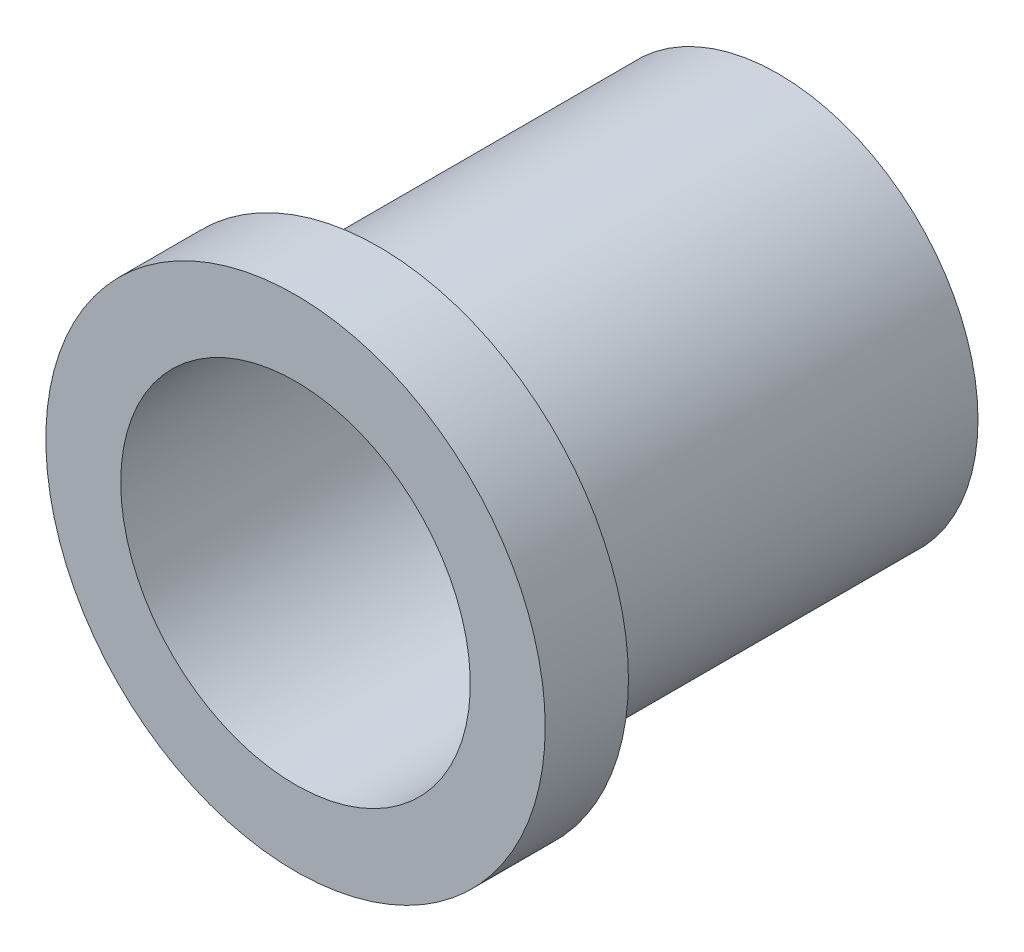
ISO-10303-21;
HEADER;
FILE_DESCRIPTION(('STEP AP214'),'2;1');
FILE_NAME('part.step','',(''),(''),'','','');
FILE_SCHEMA(('AUTOMOTIVE_DESIGN { 1 0 10303 214 1 1 1 1 }'));
ENDSEC;
DATA;
#1=APPLICATION_CONTEXT('core data for automotive mechanical design processes');
#2=APPLICATION_PROTOCOL_DEFINITION('international standard','automotive_design',2000,#1);
#3=PRODUCT_CONTEXT('',#1,'mechanical');
#4=PRODUCT('Part','Part','',(#3));
#5=PRODUCT_RELATED_PRODUCT_CATEGORY('part','',(#4));
#6=PRODUCT_DEFINITION_FORMATION('','',#4);
#7=PRODUCT_DEFINITION_CONTEXT('part definition',#1,'design');
#8=PRODUCT_DEFINITION('design','',#6,#7);
#9=PRODUCT_DEFINITION_SHAPE('','',#8);
#10=(LENGTH_UNIT() NAMED_UNIT(*) SI_UNIT(.MILLI.,.METRE.));
#11=(NAMED_UNIT(*) PLANE_ANGLE_UNIT() SI_UNIT($,.RADIAN.));
#12=(NAMED_UNIT(*) SI_UNIT($,.STERADIAN.) SOLID_ANGLE_UNIT());
#13=UNCERTAINTY_MEASURE_WITH_UNIT(LENGTH_MEASURE(1.E-05),#10,'distance_accuracy_value','');
#14=(GEOMETRIC_REPRESENTATION_CONTEXT(3) GLOBAL_UNCERTAINTY_ASSIGNED_CONTEXT((#13)) GLOBAL_UNIT_ASSIGNED_CONTEXT((#10,
#11,#12)) REPRESENTATION_CONTEXT('',''));
#15=CARTESIAN_POINT('',(0.,0.,0.));
#16=DIRECTION('',(0.,0.,1.));
#17=DIRECTION('',(1.,0.,0.));
#18=AXIS2_PLACEMENT_3D('',#15,#16,#17);
#19=CARTESIAN_POINT('',(0.,0.,24.));
#20=DIRECTION('',(0.,0.,-1.));
#21=DIRECTION('',(-1.,0.,0.));
#22=AXIS2_PLACEMENT_3D('',#19,#20,#21);
#23=CYLINDRICAL_SURFACE('',#22,12.);
#24=CARTESIAN_POINT('',(0.,0.,24.));
#25=DIRECTION('',(0.,0.,1.));
#26=DIRECTION('',(1.,0.,0.));
#27=AXIS2_PLACEMENT_3D('',#24,#25,#26);
#28=CIRCLE('',#27,12.);
#29=CARTESIAN_POINT('',(12.,0.,24.));
#30=VERTEX_POINT('',#29);
#31=EDGE_CURVE('E10',#30,#30,#28,.T.);
#32=ORIENTED_EDGE('',*,*,#31,.F.);
#33=EDGE_LOOP('',(#32));
#34=FACE_BOUND('',#33,.T.);
#35=CARTESIAN_POINT('',(0.,0.,0.));
#36=DIRECTION('',(0.,0.,1.));
#37=DIRECTION('',(1.,0.,0.));
#38=AXIS2_PLACEMENT_3D('',#35,#36,#37);
#39=CIRCLE('',#38,12.);
#40=CARTESIAN_POINT('',(12.,0.,0.));
#41=VERTEX_POINT('',#40);
#42=EDGE_CURVE('E35',#41,#41,#39,.T.);
#43=ORIENTED_EDGE('',*,*,#42,.T.);
#44=EDGE_LOOP('',(#43));
#45=FACE_BOUND('',#44,.T.);
#46=ADVANCED_FACE('F32',(#34,#45),#23,.T.);
#47=CARTESIAN_POINT('',(0.,0.,0.));
#48=DIRECTION('',(0.,0.,1.));
#49=DIRECTION('',(1.,0.,0.));
#50=AXIS2_PLACEMENT_3D('',#47,#48,#49);
#51=PLANE('',#50);
#52=CARTESIAN_POINT('',(0.,0.,0.));
#53=DIRECTION('',(0.,0.,-1.));
#54=DIRECTION('',(-1.,0.,0.));
#55=AXIS2_PLACEMENT_3D('',#52,#53,#54);
#56=CIRCLE('',#55,10.5);
#57=CARTESIAN_POINT('',(-10.5,0.,0.));
#58=VERTEX_POINT('',#57);
#59=EDGE_CURVE('E50',#58,#58,#56,.T.);
#60=ORIENTED_EDGE('',*,*,#59,.F.);
#61=EDGE_LOOP('',(#60));
#62=FACE_BOUND('',#61,.T.);
#63=ORIENTED_EDGE('',*,*,#42,.F.);
#64=EDGE_LOOP('',(#63));
#65=FACE_BOUND('',#64,.T.);
#66=ADVANCED_FACE('F66',(#62,#65),#51,.F.);
#67=CARTESIAN_POINT('',(0.,0.,29.));
#68=DIRECTION('',(0.,0.,-1.));
#69=DIRECTION('',(-1.,0.,0.));
#70=AXIS2_PLACEMENT_3D('',#67,#68,#69);
#71=CYLINDRICAL_SURFACE('',#70,15.);
#72=CARTESIAN_POINT('',(0.,0.,29.));
#73=DIRECTION('',(0.,0.,1.));
#74=DIRECTION('',(1.,0.,0.));
#75=AXIS2_PLACEMENT_3D('',#72,#73,#74);
#76=CIRCLE('',#75,15.);
#77=CARTESIAN_POINT('',(15.,0.,29.));
#78=VERTEX_POINT('',#77);
#79=EDGE_CURVE('E42',#78,#78,#76,.T.);
#80=ORIENTED_EDGE('',*,*,#79,.F.);
#81=EDGE_LOOP('',(#80));
#82=FACE_BOUND('',#81,.T.);
#83=CARTESIAN_POINT('',(0.,0.,24.));
#84=DIRECTION('',(0.,0.,1.));
#85=DIRECTION('',(1.,0.,0.));
#86=AXIS2_PLACEMENT_3D('',#83,#84,#85);
#87=CIRCLE('',#86,15.);
#88=CARTESIAN_POINT('',(15.,0.,24.));
#89=VERTEX_POINT('',#88);
#90=EDGE_CURVE('E44',#89,#89,#87,.T.);
#91=ORIENTED_EDGE('',*,*,#90,.T.);
#92=EDGE_LOOP('',(#91));
#93=FACE_BOUND('',#92,.T.);
#94=ADVANCED_FACE('F69',(#82,#93),#71,.T.);
#95=CARTESIAN_POINT('',(0.,0.,29.));
#96=DIRECTION('',(0.,0.,1.));
#97=DIRECTION('',(1.,0.,0.));
#98=AXIS2_PLACEMENT_3D('',#95,#96,#97);
#99=PLANE('',#98);
#100=CARTESIAN_POINT('',(0.,0.,29.));
#101=DIRECTION('',(0.,0.,-1.));
#102=DIRECTION('',(-1.,0.,0.));
#103=AXIS2_PLACEMENT_3D('',#100,#101,#102);
#104=CIRCLE('',#103,10.5);
#105=CARTESIAN_POINT('',(-10.5,0.,29.));
#106=VERTEX_POINT('',#105);
#107=EDGE_CURVE('E47',#106,#106,#104,.T.);
#108=ORIENTED_EDGE('',*,*,#107,.T.);
#109=EDGE_LOOP('',(#108));
#110=FACE_BOUND('',#109,.T.);
#111=ORIENTED_EDGE('',*,*,#79,.T.);
#112=EDGE_LOOP('',(#111));
#113=FACE_BOUND('',#112,.T.);
#114=ADVANCED_FACE('F56',(#110,#113),#99,.T.);
#115=CARTESIAN_POINT('',(0.,0.,24.));
#116=DIRECTION('',(0.,0.,1.));
#117=DIRECTION('',(1.,0.,0.));
#118=AXIS2_PLACEMENT_3D('',#115,#116,#117);
#119=PLANE('',#118);
#120=ORIENTED_EDGE('',*,*,#31,.T.);
#121=EDGE_LOOP('',(#120));
#122=FACE_BOUND('',#121,.T.);
#123=ORIENTED_EDGE('',*,*,#90,.F.);
#124=EDGE_LOOP('',(#123));
#125=FACE_BOUND('',#124,.T.);
#126=ADVANCED_FACE('F62',(#122,#125),#119,.F.);
#127=CARTESIAN_POINT('',(0.,0.,29.));
#128=DIRECTION('',(0.,0.,-1.));
#129=DIRECTION('',(-1.,0.,0.));
#130=AXIS2_PLACEMENT_3D('',#127,#128,#129);
#131=CYLINDRICAL_SURFACE('',#130,10.5);
#132=CARTESIAN_POINT('',(-10.5,0.,29.));
#133=CARTESIAN_POINT('',(-10.5,0.,28.6979166666667));
#134=CARTESIAN_POINT('',(-10.5,0.,28.3958333333333));
#135=CARTESIAN_POINT('',(-10.5,0.,27.7916666666667));
#136=CARTESIAN_POINT('',(-10.5,0.,27.4895833333333));
#137=CARTESIAN_POINT('',(-10.5,0.,26.8854166666667));
#138=CARTESIAN_POINT('',(-10.5,0.,26.5833333333333));
#139=CARTESIAN_POINT('',(-10.5,0.,25.9791666666667));
#140=CARTESIAN_POINT('',(-10.5,0.,25.6770833333333));
#141=CARTESIAN_POINT('',(-10.5,0.,25.0729166666667));
#142=CARTESIAN_POINT('',(-10.5,0.,24.7708333333333));
#143=CARTESIAN_POINT('',(-10.5,0.,24.1666666666667));
#144=CARTESIAN_POINT('',(-10.5,0.,23.8645833333333));
#145=CARTESIAN_POINT('',(-10.5,0.,23.2604166666667));
#146=CARTESIAN_POINT('',(-10.5,0.,22.9583333333333));
#147=CARTESIAN_POINT('',(-10.5,0.,22.3541666666667));
#148=CARTESIAN_POINT('',(-10.5,0.,22.0520833333333));
#149=CARTESIAN_POINT('',(-10.5,0.,21.4479166666667));
#150=CARTESIAN_POINT('',(-10.5,0.,21.1458333333333));
#151=CARTESIAN_POINT('',(-10.5,0.,20.5416666666667));
#152=CARTESIAN_POINT('',(-10.5,0.,20.2395833333333));
#153=CARTESIAN_POINT('',(-10.5,0.,19.6354166666667));
#154=CARTESIAN_POINT('',(-10.5,0.,19.3333333333333));
#155=CARTESIAN_POINT('',(-10.5,0.,18.7291666666667));
#156=CARTESIAN_POINT('',(-10.5,0.,18.4270833333333));
#157=CARTESIAN_POINT('',(-10.5,0.,17.8229166666667));
#158=CARTESIAN_POINT('',(-10.5,0.,17.5208333333333));
#159=CARTESIAN_POINT('',(-10.5,0.,16.9166666666667));
#160=CARTESIAN_POINT('',(-10.5,0.,16.6145833333333));
#161=CARTESIAN_POINT('',(-10.5,0.,16.0104166666667));
#162=CARTESIAN_POINT('',(-10.5,0.,15.7083333333333));
#163=CARTESIAN_POINT('',(-10.5,0.,15.1041666666667));
#164=CARTESIAN_POINT('',(-10.5,0.,14.8020833333333));
#165=CARTESIAN_POINT('',(-10.5,0.,14.1979166666667));
#166=CARTESIAN_POINT('',(-10.5,0.,13.8958333333333));
#167=CARTESIAN_POINT('',(-10.5,0.,13.2916666666667));
#168=CARTESIAN_POINT('',(-10.5,0.,12.9895833333333));
#169=CARTESIAN_POINT('',(-10.5,0.,12.3854166666667));
#170=CARTESIAN_POINT('',(-10.5,0.,12.0833333333333));
#171=CARTESIAN_POINT('',(-10.5,0.,11.4791666666667));
#172=CARTESIAN_POINT('',(-10.5,0.,11.1770833333333));
#173=CARTESIAN_POINT('',(-10.5,0.,10.5729166666667));
#174=CARTESIAN_POINT('',(-10.5,0.,10.2708333333333));
#175=CARTESIAN_POINT('',(-10.5,0.,9.66666666666667));
#176=CARTESIAN_POINT('',(-10.5,0.,9.36458333333333));
#177=CARTESIAN_POINT('',(-10.5,0.,8.76041666666667));
#178=CARTESIAN_POINT('',(-10.5,0.,8.45833333333334));
#179=CARTESIAN_POINT('',(-10.5,0.,7.85416666666667));
#180=CARTESIAN_POINT('',(-10.5,0.,7.55208333333334));
#181=CARTESIAN_POINT('',(-10.5,0.,6.94791666666667));
#182=CARTESIAN_POINT('',(-10.5,0.,6.64583333333334));
#183=CARTESIAN_POINT('',(-10.5,0.,6.04166666666667));
#184=CARTESIAN_POINT('',(-10.5,0.,5.73958333333333));
#185=CARTESIAN_POINT('',(-10.5,0.,5.13541666666667));
#186=CARTESIAN_POINT('',(-10.5,0.,4.83333333333333));
#187=CARTESIAN_POINT('',(-10.5,0.,4.22916666666667));
#188=CARTESIAN_POINT('',(-10.5,0.,3.92708333333333));
#189=CARTESIAN_POINT('',(-10.5,0.,3.32291666666667));
#190=CARTESIAN_POINT('',(-10.5,0.,3.02083333333333));
#191=CARTESIAN_POINT('',(-10.5,0.,2.41666666666667));
#192=CARTESIAN_POINT('',(-10.5,0.,2.11458333333334));
#193=CARTESIAN_POINT('',(-10.5,0.,1.51041666666667));
#194=CARTESIAN_POINT('',(-10.5,0.,1.20833333333333));
#195=CARTESIAN_POINT('',(-10.5,0.,0.604166666666667));
#196=CARTESIAN_POINT('',(-10.5,0.,0.302083333333333));
#197=CARTESIAN_POINT('',(-10.5,0.,0.));
#198=B_SPLINE_CURVE_WITH_KNOTS('',3,(#132,#133,#134,#135,#136,#137,#138,#139,#140,#141,#142,
#143,#144,#145,#146,#147,#148,#149,#150,#151,#152,#153,#154,#155,#156,#157,#158,#159,#160,#161,
#162,#163,#164,#165,#166,#167,#168,#169,#170,#171,#172,#173,#174,#175,#176,#177,#178,#179,#180,
#181,#182,#183,#184,#185,#186,#187,#188,#189,#190,#191,#192,#193,#194,#195,#196,#197),
.UNSPECIFIED.,.F.,.F.,(4,2,2,2,2,2,2,2,2,2,2,2,2,2,2,2,2,2,2,2,2,2,2,2,2,2,2,2,2,2,2,2,4),(0.,
0.906250000000001,1.8125,2.71875,3.625,4.53125,5.4375,6.34375,7.25,8.15625,9.0625,
9.96875000000001,10.875,11.78125,12.6875,13.59375,14.5,15.40625,16.3125,17.21875,18.125,
19.03125,19.9375,20.84375,21.75,22.65625,23.5625,24.46875,25.375,26.28125,27.1875,28.09375,29.),.UNSPECIFIED.);
#199=EDGE_CURVE('BSEAM59',#106,#58,#198,.T.);
#200=ORIENTED_EDGE('',*,*,#107,.F.);
#201=ORIENTED_EDGE('',*,*,#59,.T.);
#202=ORIENTED_EDGE('',*,*,#199,.T.);
#203=ORIENTED_EDGE('',*,*,#199,.F.);
#204=EDGE_LOOP('',(#200,#202,#201,#203));
#205=FACE_BOUND('',#204,.T.);
#206=ADVANCED_FACE('F59',(#205),#131,.F.);
#207=CLOSED_SHELL('',(#46,#66,#94,#114,#126,#206));
#208=MANIFOLD_SOLID_BREP('B2',#207);
#209=ADVANCED_BREP_SHAPE_REPRESENTATION('',(#18,#208),#14);
#210=SHAPE_DEFINITION_REPRESENTATION(#9,#209);
ENDSEC;
END-ISO-10303-21;
